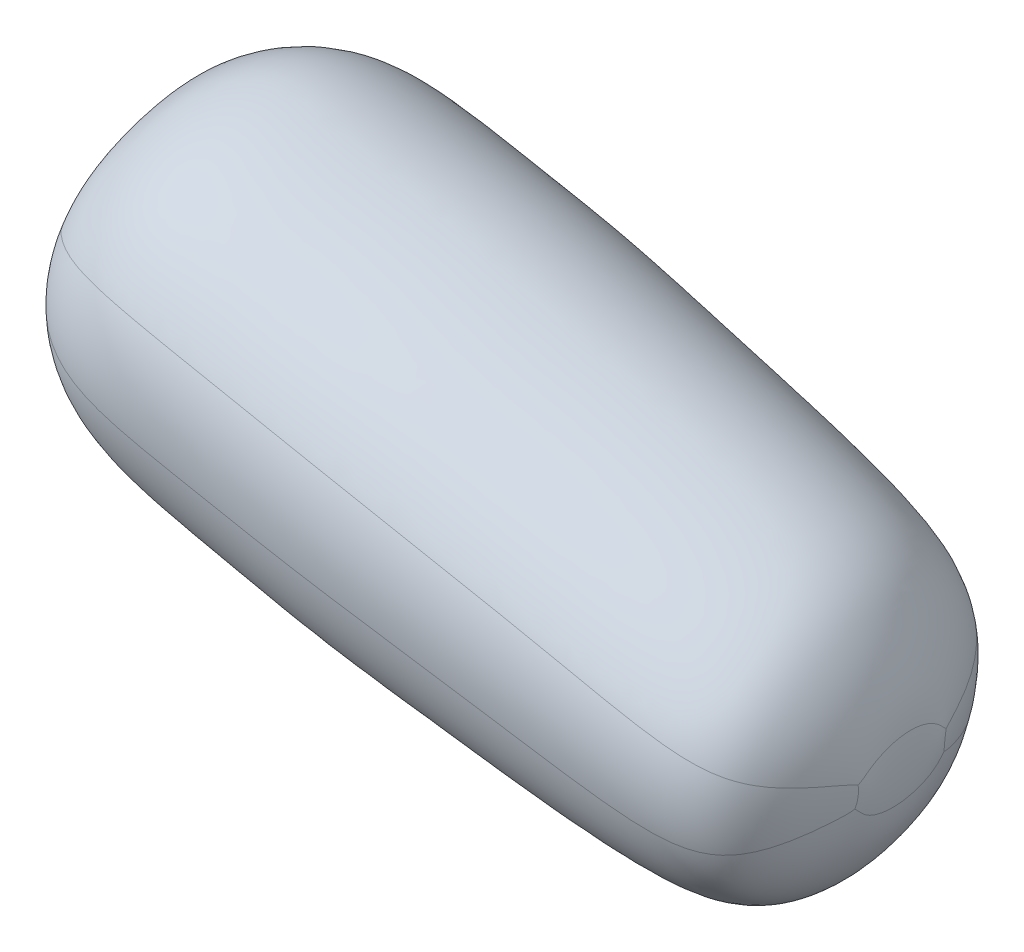
ISO-10303-21;
HEADER;
FILE_DESCRIPTION(('STEP AP214'),'2;1');
FILE_NAME('part.step','',(''),(''),'','','');
FILE_SCHEMA(('AUTOMOTIVE_DESIGN { 1 0 10303 214 1 1 1 1 }'));
ENDSEC;
DATA;
#1=APPLICATION_CONTEXT('core data for automotive mechanical design processes');
#2=APPLICATION_PROTOCOL_DEFINITION('international standard','automotive_design',2000,#1);
#3=PRODUCT_CONTEXT('',#1,'mechanical');
#4=PRODUCT('Part','Part','',(#3));
#5=PRODUCT_RELATED_PRODUCT_CATEGORY('part','',(#4));
#6=PRODUCT_DEFINITION_FORMATION('','',#4);
#7=PRODUCT_DEFINITION_CONTEXT('part definition',#1,'design');
#8=PRODUCT_DEFINITION('design','',#6,#7);
#9=PRODUCT_DEFINITION_SHAPE('','',#8);
#10=(LENGTH_UNIT() NAMED_UNIT(*) SI_UNIT(.MILLI.,.METRE.));
#11=(NAMED_UNIT(*) PLANE_ANGLE_UNIT() SI_UNIT($,.RADIAN.));
#12=(NAMED_UNIT(*) SI_UNIT($,.STERADIAN.) SOLID_ANGLE_UNIT());
#13=UNCERTAINTY_MEASURE_WITH_UNIT(LENGTH_MEASURE(1.E-05),#10,'distance_accuracy_value','');
#14=(GEOMETRIC_REPRESENTATION_CONTEXT(3) GLOBAL_UNCERTAINTY_ASSIGNED_CONTEXT((#13)) GLOBAL_UNIT_ASSIGNED_CONTEXT((#10,
#11,#12)) REPRESENTATION_CONTEXT('',''));
#15=CARTESIAN_POINT('',(0.,0.,0.));
#16=DIRECTION('',(0.,0.,1.));
#17=DIRECTION('',(1.,0.,0.));
#18=AXIS2_PLACEMENT_3D('',#15,#16,#17);
#19=CARTESIAN_POINT('',(749.018541667474,1299.29943309952,-39.3241918801321));
#20=CARTESIAN_POINT('',(748.968023117321,1299.12745624252,-39.1103358303124));
#21=CARTESIAN_POINT('',(748.921842982339,1298.60047448023,-38.3958155175608));
#22=CARTESIAN_POINT('',(748.958254212354,1298.18930311902,-36.544455689012));
#23=CARTESIAN_POINT('',(749.067359383194,1298.22396791715,-34.3213677022218));
#24=CARTESIAN_POINT('',(749.170808756302,1298.80538507709,-32.4721043275103));
#25=CARTESIAN_POINT('',(749.317559113874,1299.4224221733,-31.7430094882292));
#26=CARTESIAN_POINT('',(749.403543107487,1299.62461093897,-31.5344131035057));
#27=CARTESIAN_POINT('',(749.084853868602,1299.15538746618,-39.5640009505484));
#28=CARTESIAN_POINT('',(749.050128969421,1298.66738811878,-39.376097921347));
#29=CARTESIAN_POINT('',(748.985205907322,1297.81789531565,-38.6021233571736));
#30=CARTESIAN_POINT('',(749.00364811543,1297.12814905394,-36.5923854652337));
#31=CARTESIAN_POINT('',(749.103959058563,1297.14198785673,-34.1607295717356));
#32=CARTESIAN_POINT('',(749.210329856262,1298.01205297038,-32.1958273075664));
#33=CARTESIAN_POINT('',(749.393326789782,1298.96928019339,-31.4266106565444));
#34=CARTESIAN_POINT('',(749.484418942238,1299.49913433185,-31.2719154953125));
#35=CARTESIAN_POINT('',(749.508329764697,1298.74755809971,-40.6771228116173));
#36=CARTESIAN_POINT('',(749.457194964389,1297.94447521268,-40.4427472239462));
#37=CARTESIAN_POINT('',(749.367917852987,1296.45819919977,-39.4599283473798));
#38=CARTESIAN_POINT('',(749.36514847526,1295.21237476676,-36.8801333719154));
#39=CARTESIAN_POINT('',(749.482979811134,1295.1903337214,-33.7123004317897));
#40=CARTESIAN_POINT('',(749.597838271913,1296.68020352945,-31.2406782504654));
#41=CARTESIAN_POINT('',(749.856138915369,1298.32535172501,-30.2804538632428));
#42=CARTESIAN_POINT('',(749.994292770972,1299.19217093011,-30.1011356266091));
#43=CARTESIAN_POINT('',(751.159101495368,1298.16254087205,-42.5301420695348));
#44=CARTESIAN_POINT('',(751.090739807056,1297.03129175183,-42.2197436658514));
#45=CARTESIAN_POINT('',(750.978604694835,1294.87139937441,-40.9206519017501));
#46=CARTESIAN_POINT('',(750.988425906881,1293.06120799126,-37.4366596610061));
#47=CARTESIAN_POINT('',(751.134735672272,1293.02703465824,-33.1429411317832));
#48=CARTESIAN_POINT('',(751.290427862375,1295.13956930941,-29.7995788399963));
#49=CARTESIAN_POINT('',(751.627693644699,1297.50121875444,-28.5578467240097));
#50=CARTESIAN_POINT('',(751.81180027039,1298.71775647201,-28.3327488822175));
#51=CARTESIAN_POINT('',(754.158925568147,1297.75217231123,-44.0966049191266));
#52=CARTESIAN_POINT('',(754.077962942074,1296.39950812657,-43.7583980302759));
#53=CARTESIAN_POINT('',(753.9284249418,1293.79667230982,-42.2545805197566));
#54=CARTESIAN_POINT('',(753.939011988292,1291.66450571481,-38.1003517039714));
#55=CARTESIAN_POINT('',(754.136532396949,1291.5170637204,-32.7433163500145));
#56=CARTESIAN_POINT('',(754.185210396786,1294.0676386807,-28.8669009994952));
#57=CARTESIAN_POINT('',(754.624516853756,1296.90224055679,-27.3499805738409));
#58=CARTESIAN_POINT('',(754.874182900671,1298.36097473205,-27.0935829459881));
#59=CARTESIAN_POINT('',(759.260059202705,1296.72634151576,-44.0892882591809));
#60=CARTESIAN_POINT('',(759.188571861757,1295.38447899291,-43.7634695952496));
#61=CARTESIAN_POINT('',(759.116865196907,1292.81337476417,-42.3664437740535));
#62=CARTESIAN_POINT('',(759.051094584353,1290.60771608189,-38.1767353516374));
#63=CARTESIAN_POINT('',(759.269649343386,1290.50676225331,-32.8325519254892));
#64=CARTESIAN_POINT('',(759.272897360054,1293.11550727952,-28.6961828423486));
#65=CARTESIAN_POINT('',(759.592042212166,1295.92873935312,-27.3697014354678));
#66=CARTESIAN_POINT('',(759.777743721762,1297.36899138893,-27.1634403821383));
#67=CARTESIAN_POINT('',(764.359598507454,1295.68966984192,-44.1377718399809));
#68=CARTESIAN_POINT('',(764.297141783323,1294.3497237597,-43.8222420731529));
#69=CARTESIAN_POINT('',(764.303322185729,1291.79340975998,-42.5234024059993));
#70=CARTESIAN_POINT('',(764.160442736961,1289.49909222758,-38.2700821984146));
#71=CARTESIAN_POINT('',(764.401450616776,1289.44423329104,-32.9031520404126));
#72=CARTESIAN_POINT('',(764.359114121423,1292.12893484192,-28.4775271784854));
#73=CARTESIAN_POINT('',(764.559390726144,1294.93942759454,-27.3339008787694));
#74=CARTESIAN_POINT('',(764.681927217236,1296.37068424349,-27.176733804727));
#75=CARTESIAN_POINT('',(769.305658000978,1294.47848171011,-43.9758059663483));
#76=CARTESIAN_POINT('',(769.246563482863,1293.17482879811,-43.6646991355105));
#77=CARTESIAN_POINT('',(769.21216591875,1290.70191218997,-42.4016559067257));
#78=CARTESIAN_POINT('',(769.304206445576,1288.39484916011,-38.2747122486566));
#79=CARTESIAN_POINT('',(769.63861961332,1288.42080287424,-33.0709216037393));
#80=CARTESIAN_POINT('',(769.791706729893,1291.08679895335,-28.8649703374483));
#81=CARTESIAN_POINT('',(769.980749126011,1293.71904473488,-27.7921705999364));
#82=CARTESIAN_POINT('',(770.097852166481,1295.06798170679,-27.6410399972934));
#83=CARTESIAN_POINT('',(774.250124603961,1293.25644652775,-43.8696367085395));
#84=CARTESIAN_POINT('',(774.1939982776,1291.98021155004,-43.5608669169528));
#85=CARTESIAN_POINT('',(774.11917496312,1289.57379726366,-42.3250508260744));
#86=CARTESIAN_POINT('',(774.445080130759,1287.2387616545,-38.29627223435));
#87=CARTESIAN_POINT('',(774.874549501232,1287.34516095879,-33.2200726487472));
#88=CARTESIAN_POINT('',(775.22275257202,1290.0102060318,-29.2044590474841));
#89=CARTESIAN_POINT('',(775.401856684461,1292.48282243605,-28.1948964196627));
#90=CARTESIAN_POINT('',(775.51435123683,1293.75893167989,-28.0487657678662));
#91=CARTESIAN_POINT('',(779.911604390351,1291.88631842835,-43.5345811251691));
#92=CARTESIAN_POINT('',(779.84212559963,1290.74442982744,-43.2060765564798));
#93=CARTESIAN_POINT('',(779.792366170491,1288.6415149776,-41.9550327097827));
#94=CARTESIAN_POINT('',(779.969778214876,1286.89541935905,-38.1059991457864));
#95=CARTESIAN_POINT('',(780.553411945737,1287.10996654145,-33.7431364954069));
#96=CARTESIAN_POINT('',(780.980248317365,1289.03288607653,-29.8618781750851));
#97=CARTESIAN_POINT('',(781.034947373286,1291.10250828784,-28.8442018591539));
#98=CARTESIAN_POINT('',(781.088743792467,1292.24585692288,-28.6598410091077));
#99=CARTESIAN_POINT('',(781.954466116197,1291.85891593961,-41.9992549173569));
#100=CARTESIAN_POINT('',(781.900042601189,1290.96443613594,-41.7419267914149));
#101=CARTESIAN_POINT('',(781.861037021472,1289.31716383133,-40.7619414842372));
#102=CARTESIAN_POINT('',(782.000030012187,1287.94938613228,-37.7468677684114));
#103=CARTESIAN_POINT('',(782.457129097251,1288.11744231065,-34.3292764202205));
#104=CARTESIAN_POINT('',(782.791487287273,1289.62371590093,-31.2889499508345));
#105=CARTESIAN_POINT('',(782.834387591956,1291.24493251512,-30.4917854595828));
#106=CARTESIAN_POINT('',(782.876535467167,1292.14055692621,-30.3473716754841));
#107=CARTESIAN_POINT('',(783.221064790446,1292.39637914558,-40.1130063796312));
#108=CARTESIAN_POINT('',(783.185705860261,1291.81496718503,-39.945746443659));
#109=CARTESIAN_POINT('',(783.160407096932,1290.74423970264,-39.3087677360611));
#110=CARTESIAN_POINT('',(783.250696132911,1289.85516615688,-37.3489553897654));
#111=CARTESIAN_POINT('',(783.547751089496,1289.96438650962,-35.1275007675587));
#112=CARTESIAN_POINT('',(783.765164160147,1290.94350235985,-33.1513155412431));
#113=CARTESIAN_POINT('',(783.793027532704,1291.99727819779,-32.6331532495534));
#114=CARTESIAN_POINT('',(783.820424786622,1292.57943094054,-32.5392837346044));
#115=CARTESIAN_POINT('',(783.733848706613,1292.70458484944,-38.9132354218247));
#116=CARTESIAN_POINT('',(783.710272124661,1292.31697504891,-38.8017269676203));
#117=CARTESIAN_POINT('',(783.693423193036,1291.60316010099,-38.3770788305007));
#118=CARTESIAN_POINT('',(783.753587950324,1291.01045223097,-37.0705363052411));
#119=CARTESIAN_POINT('',(783.951678859933,1291.08325604569,-35.5895729586269));
#120=CARTESIAN_POINT('',(784.096566479582,1291.73600942798,-34.272110594069));
#121=CARTESIAN_POINT('',(784.115125254385,1292.43852346069,-33.9266641619919));
#122=CARTESIAN_POINT('',(784.133386128494,1292.82662346234,-33.864082655158));
#123=CARTESIAN_POINT('',(783.824675659282,1292.82193916687,-38.6903076526872));
#124=CARTESIAN_POINT('',(783.858300844621,1292.68681142531,-38.5230895410272));
#125=CARTESIAN_POINT('',(783.84827987084,1292.23715533116,-38.158234930649));
#126=CARTESIAN_POINT('',(783.906766304208,1291.8757474699,-37.0329882576437));
#127=CARTESIAN_POINT('',(784.072469242042,1291.93054155875,-35.7468532540145));
#128=CARTESIAN_POINT('',(784.192443790283,1292.34199258987,-34.5957975937848));
#129=CARTESIAN_POINT('',(784.206802638554,1292.79102214041,-34.2764277174584));
#130=CARTESIAN_POINT('',(784.18841742658,1292.93225591494,-34.1181188610803));
#131=(BOUNDED_SURFACE() B_SPLINE_SURFACE(3,3,((#19,#20,#21,#22,#23,#24,#25,#26),(#27,#28,#29,
#30,#31,#32,#33,#34),(#35,#36,#37,#38,#39,#40,#41,#42),(#43,#44,#45,#46,#47,#48,#49,#50),(#51,
#52,#53,#54,#55,#56,#57,#58),(#59,#60,#61,#62,#63,#64,#65,#66),(#67,#68,#69,#70,#71,#72,#73,
#74),(#75,#76,#77,#78,#79,#80,#81,#82),(#83,#84,#85,#86,#87,#88,#89,#90),(#91,#92,#93,#94,#95,
#96,#97,#98),(#99,#100,#101,#102,#103,#104,#105,#106),(#107,#108,#109,#110,#111,#112,#113,#114),
(#115,#116,#117,#118,#119,#120,#121,#122),(#123,#124,#125,#126,#127,#128,#129,#130)),
.UNSPECIFIED.,.F.,.F.,.F.) B_SPLINE_SURFACE_WITH_KNOTS((4,1,1,1,1,1,1,1,1,1,1,4),(4,1,1,1,1,4),
(0.,1.,2.,3.,4.,5.,6.,7.,8.,9.,10.,11.),(0.,1.,2.,3.,4.,5.),
.UNSPECIFIED.) GEOMETRIC_REPRESENTATION_ITEM() RATIONAL_B_SPLINE_SURFACE(((0.75,1.,1.,1.,1.,1.,
1.,0.75),(1.,1.,1.,1.,1.,1.,1.,1.),(1.,1.,1.,1.,1.,1.,1.,1.),(1.,1.,1.,1.,1.,1.,1.,1.),(1.,1.,
1.,1.,1.,1.,1.,1.),(1.,1.,1.,1.,1.,1.,1.,1.),(1.,1.,1.,1.,1.,1.,1.,1.),(1.,1.,1.,1.,1.,1.,1.,
1.),(1.,1.,1.,1.,1.,1.,1.,1.),(1.,1.,1.,1.,1.,1.,1.,1.),(1.,1.,1.,1.,1.,1.,1.,1.),(1.,1.,1.,1.,
1.,1.,1.,1.),(1.,1.,1.,1.,1.,1.,1.,1.),(0.75,1.,1.,1.,1.,1.,1.,0.75))) REPRESENTATION_ITEM('') SURFACE());
#132=CARTESIAN_POINT('',(783.824675659282,1292.82193916687,-38.6903076526872));
#133=CARTESIAN_POINT('',(783.733848706613,1292.70458484944,-38.9132354218247));
#134=CARTESIAN_POINT('',(783.221064790446,1292.39637914558,-40.1130063796312));
#135=CARTESIAN_POINT('',(781.954466116197,1291.85891593961,-41.9992549173569));
#136=CARTESIAN_POINT('',(779.911604390351,1291.88631842835,-43.5345811251691));
#137=CARTESIAN_POINT('',(774.250124603961,1293.25644652775,-43.8696367085395));
#138=CARTESIAN_POINT('',(769.305658000978,1294.47848171011,-43.9758059663483));
#139=CARTESIAN_POINT('',(764.359598507454,1295.68966984192,-44.1377718399809));
#140=CARTESIAN_POINT('',(759.260059202705,1296.72634151576,-44.0892882591809));
#141=CARTESIAN_POINT('',(754.158925568147,1297.75217231123,-44.0966049191266));
#142=CARTESIAN_POINT('',(751.159101495368,1298.16254087205,-42.5301420695348));
#143=CARTESIAN_POINT('',(749.508329764697,1298.74755809971,-40.6771228116173));
#144=CARTESIAN_POINT('',(749.084853868602,1299.15538746618,-39.5640009505484));
#145=CARTESIAN_POINT('',(749.018541667474,1299.29943309952,-39.3241918801321));
#146=(BOUNDED_CURVE() B_SPLINE_CURVE(3,(#132,#133,#134,#135,#136,#137,#138,#139,#140,#141,#142,
#143,#144,#145),.UNSPECIFIED.,.F.,.F.) B_SPLINE_CURVE_WITH_KNOTS((4,1,1,1,1,1,1,1,1,1,1,4),(0.,
1.,2.,3.,4.,5.,6.,7.,8.,9.,10.,11.),
.UNSPECIFIED.) CURVE() GEOMETRIC_REPRESENTATION_ITEM() RATIONAL_B_SPLINE_CURVE((0.75,1.,1.,1.,
1.,1.,1.,1.,1.,1.,1.,1.,1.,0.75)) REPRESENTATION_ITEM(''));
#147=CARTESIAN_POINT('',(783.824675659282,1292.82193916687,-38.6903076526872));
#148=VERTEX_POINT('',#147);
#149=CARTESIAN_POINT('',(749.018541667474,1299.29943309952,-39.3241918801321));
#150=VERTEX_POINT('',#149);
#151=EDGE_CURVE('E73',#148,#150,#146,.T.);
#152=CARTESIAN_POINT('',(783.824675659282,1292.82193916687,-38.6903076526872));
#153=CARTESIAN_POINT('',(783.858300844621,1292.68681142531,-38.5230895410272));
#154=CARTESIAN_POINT('',(783.84827987084,1292.23715533116,-38.158234930649));
#155=CARTESIAN_POINT('',(783.906766304208,1291.8757474699,-37.0329882576437));
#156=CARTESIAN_POINT('',(784.072469242042,1291.93054155875,-35.7468532540145));
#157=CARTESIAN_POINT('',(784.192443790283,1292.34199258987,-34.5957975937848));
#158=CARTESIAN_POINT('',(784.206802638554,1292.79102214041,-34.2764277174584));
#159=CARTESIAN_POINT('',(784.18841742658,1292.93225591494,-34.1181188610803));
#160=(BOUNDED_CURVE() B_SPLINE_CURVE(3,(#152,#153,#154,#155,#156,#157,#158,#159),.UNSPECIFIED.,
.F.,.F.) B_SPLINE_CURVE_WITH_KNOTS((4,1,1,1,1,4),(0.,1.,2.,3.,4.,5.),
.UNSPECIFIED.) CURVE() GEOMETRIC_REPRESENTATION_ITEM() RATIONAL_B_SPLINE_CURVE((0.75,1.,1.,1.,
1.,1.,1.,0.75)) REPRESENTATION_ITEM(''));
#161=CARTESIAN_POINT('',(784.18841742658,1292.93225591494,-34.1181188610803));
#162=VERTEX_POINT('',#161);
#163=EDGE_CURVE('E77',#162,#148,#160,.F.);
#164=CARTESIAN_POINT('',(749.403543107487,1299.62461093897,-31.5344131035057));
#165=CARTESIAN_POINT('',(749.484418942238,1299.49913433185,-31.2719154953125));
#166=CARTESIAN_POINT('',(749.994292770972,1299.19217093011,-30.1011356266091));
#167=CARTESIAN_POINT('',(751.81180027039,1298.71775647201,-28.3327488822175));
#168=CARTESIAN_POINT('',(754.874182900671,1298.36097473205,-27.0935829459881));
#169=CARTESIAN_POINT('',(759.777743721762,1297.36899138893,-27.1634403821383));
#170=CARTESIAN_POINT('',(764.681927217236,1296.37068424349,-27.176733804727));
#171=CARTESIAN_POINT('',(770.097852166481,1295.06798170679,-27.6410399972934));
#172=CARTESIAN_POINT('',(775.51435123683,1293.75893167989,-28.0487657678662));
#173=CARTESIAN_POINT('',(781.088743792467,1292.24585692288,-28.6598410091077));
#174=CARTESIAN_POINT('',(782.876535467167,1292.14055692621,-30.3473716754841));
#175=CARTESIAN_POINT('',(783.820424786622,1292.57943094054,-32.5392837346044));
#176=CARTESIAN_POINT('',(784.133386128494,1292.82662346234,-33.864082655158));
#177=CARTESIAN_POINT('',(784.18841742658,1292.93225591494,-34.1181188610803));
#178=(BOUNDED_CURVE() B_SPLINE_CURVE(3,(#164,#165,#166,#167,#168,#169,#170,#171,#172,#173,#174,
#175,#176,#177),.UNSPECIFIED.,.F.,.F.) B_SPLINE_CURVE_WITH_KNOTS((4,1,1,1,1,1,1,1,1,1,1,4),(0.,
1.,2.,3.,4.,5.,6.,7.,8.,9.,10.,11.),
.UNSPECIFIED.) CURVE() GEOMETRIC_REPRESENTATION_ITEM() RATIONAL_B_SPLINE_CURVE((0.75,1.,1.,1.,
1.,1.,1.,1.,1.,1.,1.,1.,1.,0.75)) REPRESENTATION_ITEM(''));
#179=CARTESIAN_POINT('',(749.403543107487,1299.62461093896,-31.5344131035057));
#180=VERTEX_POINT('',#179);
#181=EDGE_CURVE('E105',#180,#162,#178,.T.);
#182=CARTESIAN_POINT('',(749.018541667474,1299.29943309952,-39.3241918801321));
#183=CARTESIAN_POINT('',(748.968023117321,1299.12745624252,-39.1103358303124));
#184=CARTESIAN_POINT('',(748.921842982339,1298.60047448023,-38.3958155175608));
#185=CARTESIAN_POINT('',(748.958254212354,1298.18930311902,-36.544455689012));
#186=CARTESIAN_POINT('',(749.067359383194,1298.22396791715,-34.3213677022218));
#187=CARTESIAN_POINT('',(749.170808756302,1298.80538507709,-32.4721043275103));
#188=CARTESIAN_POINT('',(749.317559113874,1299.4224221733,-31.7430094882292));
#189=CARTESIAN_POINT('',(749.403543107487,1299.62461093897,-31.5344131035057));
#190=(BOUNDED_CURVE() B_SPLINE_CURVE(3,(#182,#183,#184,#185,#186,#187,#188,#189),.UNSPECIFIED.,
.F.,.F.) B_SPLINE_CURVE_WITH_KNOTS((4,1,1,1,1,4),(0.,1.,2.,3.,4.,5.),
.UNSPECIFIED.) CURVE() GEOMETRIC_REPRESENTATION_ITEM() RATIONAL_B_SPLINE_CURVE((0.75,1.,1.,1.,
1.,1.,1.,0.75)) REPRESENTATION_ITEM(''));
#191=EDGE_CURVE('E79',#150,#180,#190,.T.);
#192=ORIENTED_EDGE('',*,*,#151,.F.);
#193=ORIENTED_EDGE('',*,*,#163,.F.);
#194=ORIENTED_EDGE('',*,*,#181,.F.);
#195=ORIENTED_EDGE('',*,*,#191,.F.);
#196=EDGE_LOOP('',(#192,#193,#194,#195));
#197=FACE_BOUND('',#196,.T.);
#198=ADVANCED_FACE('F33',(#197),#131,.T.);
#199=CARTESIAN_POINT('',(749.101250467563,1300.48399524673,-39.3216260351981));
#200=CARTESIAN_POINT('',(749.073592183802,1300.62867331672,-39.112077674764));
#201=CARTESIAN_POINT('',(749.100918501394,1301.05500426717,-38.4400274260165));
#202=CARTESIAN_POINT('',(749.212644565611,1301.48806183071,-36.6751346326217));
#203=CARTESIAN_POINT('',(749.398216643835,1301.59298521083,-34.5896839463824));
#204=CARTESIAN_POINT('',(749.489589829749,1301.36064860402,-32.6766597096824));
#205=CARTESIAN_POINT('',(749.535321997387,1300.99397462831,-31.9037756667972));
#206=CARTESIAN_POINT('',(749.578946975891,1300.86601079745,-31.6666632235885));
#207=CARTESIAN_POINT('',(749.040902796788,1300.17042163372,-39.2935484823008));
#208=CARTESIAN_POINT('',(748.925238558502,1300.14620416065,-38.8463742085353));
#209=CARTESIAN_POINT('',(748.923110180213,1300.268363916,-38.2057944938202));
#210=CARTESIAN_POINT('',(749.002822683051,1300.41487817064,-36.5445403136712));
#211=CARTESIAN_POINT('',(749.147070733387,1300.49408103076,-34.5790675237182));
#212=CARTESIAN_POINT('',(749.245999664246,1300.51945667678,-32.8233608587861));
#213=CARTESIAN_POINT('',(749.321662148964,1300.45988387879,-32.119127586622));
#214=CARTESIAN_POINT('',(749.493929540927,1300.53498350725,-31.6557829618748));
#215=CARTESIAN_POINT('',(749.002748016501,1299.61545558991,-39.2982388595247));
#216=CARTESIAN_POINT('',(748.885917265211,1299.58752436625,-38.8445737392996));
#217=CARTESIAN_POINT('',(748.858480057356,1299.38305364479,-38.189507677948));
#218=CARTESIAN_POINT('',(748.912860309285,1299.25045718408,-36.4965259127793));
#219=CARTESIAN_POINT('',(749.030759707826,1299.30594797757,-34.4820058327189));
#220=CARTESIAN_POINT('',(749.131287656343,1299.59871718382,-32.7483813474542));
#221=CARTESIAN_POINT('',(749.241791437975,1299.87556415318,-32.059408319914));
#222=CARTESIAN_POINT('',(749.40865126634,1299.95227631174,-31.5883143269973));
#223=CARTESIAN_POINT('',(749.018541667474,1299.29943309952,-39.3241918801321));
#224=CARTESIAN_POINT('',(748.968023117321,1299.12745624252,-39.1103358303124));
#225=CARTESIAN_POINT('',(748.921842982339,1298.60047448023,-38.3958155175608));
#226=CARTESIAN_POINT('',(748.958254212354,1298.18930311902,-36.544455689012));
#227=CARTESIAN_POINT('',(749.067359383194,1298.22396791715,-34.3213677022218));
#228=CARTESIAN_POINT('',(749.170808756302,1298.80538507709,-32.4721043275103));
#229=CARTESIAN_POINT('',(749.317559113874,1299.4224221733,-31.7430094882292));
#230=CARTESIAN_POINT('',(749.403543107487,1299.62461093897,-31.5344131035057));
#231=(BOUNDED_SURFACE() B_SPLINE_SURFACE(3,3,((#199,#200,#201,#202,#203,#204,#205,#206),(#207,
#208,#209,#210,#211,#212,#213,#214),(#215,#216,#217,#218,#219,#220,#221,#222),(#223,#224,#225,
#226,#227,#228,#229,#230)),.UNSPECIFIED.,.F.,.F.,.F.) B_SPLINE_SURFACE_WITH_KNOTS((4,4),(4,1,1,
1,1,4),(0.,1.),(0.,1.,2.,3.,4.,5.),
.UNSPECIFIED.) GEOMETRIC_REPRESENTATION_ITEM() RATIONAL_B_SPLINE_SURFACE(((0.75,1.,1.,1.,1.,1.,
1.,0.75),(1.,1.,1.,1.,1.,1.,1.,1.),(1.,1.,1.,1.,1.,1.,1.,1.),(0.75,1.,1.,1.,1.,1.,1.,0.75))) REPRESENTATION_ITEM('') SURFACE());
#232=CARTESIAN_POINT('',(749.101250467563,1300.48399524673,-39.3216260351981));
#233=CARTESIAN_POINT('',(749.040902796788,1300.17042163372,-39.2935484823008));
#234=CARTESIAN_POINT('',(749.002748016501,1299.61545558991,-39.2982388595247));
#235=CARTESIAN_POINT('',(749.018541667474,1299.29943309952,-39.3241918801321));
#236=(BOUNDED_CURVE() B_SPLINE_CURVE(3,(#232,#233,#234,#235),.UNSPECIFIED.,.F.,
.F.) B_SPLINE_CURVE_WITH_KNOTS((4,4),(0.,1.),
.UNSPECIFIED.) CURVE() GEOMETRIC_REPRESENTATION_ITEM() RATIONAL_B_SPLINE_CURVE((0.75,1.,1.,0.75)) REPRESENTATION_ITEM(''));
#237=CARTESIAN_POINT('',(749.101250467562,1300.48399524673,-39.321626035198));
#238=VERTEX_POINT('',#237);
#239=EDGE_CURVE('E82',#150,#238,#236,.F.);
#240=CARTESIAN_POINT('',(749.403543107487,1299.62461093897,-31.5344131035057));
#241=CARTESIAN_POINT('',(749.40865126634,1299.95227631174,-31.5883143269973));
#242=CARTESIAN_POINT('',(749.493929540927,1300.53498350725,-31.6557829618748));
#243=CARTESIAN_POINT('',(749.578946975891,1300.86601079745,-31.6666632235885));
#244=(BOUNDED_CURVE() B_SPLINE_CURVE(3,(#240,#241,#242,#243),.UNSPECIFIED.,.F.,
.F.) B_SPLINE_CURVE_WITH_KNOTS((4,4),(0.,1.),
.UNSPECIFIED.) CURVE() GEOMETRIC_REPRESENTATION_ITEM() RATIONAL_B_SPLINE_CURVE((0.75,1.,1.,0.75)) REPRESENTATION_ITEM(''));
#245=CARTESIAN_POINT('',(749.578946975891,1300.86601079745,-31.6666632235885));
#246=VERTEX_POINT('',#245);
#247=EDGE_CURVE('E96',#246,#180,#244,.F.);
#248=CARTESIAN_POINT('',(749.578946975891,1300.86601079745,-31.6666632235885));
#249=CARTESIAN_POINT('',(749.535321997387,1300.99397462831,-31.9037756667972));
#250=CARTESIAN_POINT('',(749.489589829749,1301.36064860402,-32.6766597096824));
#251=CARTESIAN_POINT('',(749.398216643835,1301.59298521083,-34.5896839463824));
#252=CARTESIAN_POINT('',(749.212644565611,1301.48806183071,-36.6751346326217));
#253=CARTESIAN_POINT('',(749.100918501394,1301.05500426717,-38.4400274260165));
#254=CARTESIAN_POINT('',(749.073592183802,1300.62867331672,-39.112077674764));
#255=CARTESIAN_POINT('',(749.101250467563,1300.48399524673,-39.3216260351981));
#256=(BOUNDED_CURVE() B_SPLINE_CURVE(3,(#248,#249,#250,#251,#252,#253,#254,#255),.UNSPECIFIED.,
.F.,.F.) B_SPLINE_CURVE_WITH_KNOTS((4,1,1,1,1,4),(0.,1.,2.,3.,4.,5.),
.UNSPECIFIED.) CURVE() GEOMETRIC_REPRESENTATION_ITEM() RATIONAL_B_SPLINE_CURVE((0.75,1.,1.,1.,
1.,1.,1.,0.75)) REPRESENTATION_ITEM(''));
#257=EDGE_CURVE('E54',#238,#246,#256,.F.);
#258=ORIENTED_EDGE('',*,*,#239,.F.);
#259=ORIENTED_EDGE('',*,*,#191,.T.);
#260=ORIENTED_EDGE('',*,*,#247,.F.);
#261=ORIENTED_EDGE('',*,*,#257,.F.);
#262=EDGE_LOOP('',(#258,#259,#260,#261));
#263=FACE_BOUND('',#262,.T.);
#264=ADVANCED_FACE('F190',(#263),#231,.T.);
#265=CARTESIAN_POINT('',(783.89386485346,1293.77582107737,-38.7184259989586));
#266=CARTESIAN_POINT('',(783.820745344025,1293.89107330477,-38.9480454988233));
#267=CARTESIAN_POINT('',(783.351372971606,1294.17609994818,-40.1652079554513));
#268=CARTESIAN_POINT('',(782.154976271259,1294.5969508574,-42.0795718472466));
#269=CARTESIAN_POINT('',(780.167618383781,1295.38167061067,-43.637119036913));
#270=CARTESIAN_POINT('',(774.497709253935,1297.06248381358,-43.8849708398168));
#271=CARTESIAN_POINT('',(769.570746852778,1298.35804353739,-43.9681212228532));
#272=CARTESIAN_POINT('',(764.644107719398,1299.66914762626,-44.1068784425305));
#273=CARTESIAN_POINT('',(759.532119251981,1300.69860075867,-44.0253802519605));
#274=CARTESIAN_POINT('',(754.42055697491,1301.74360801755,-43.9995133135164));
#275=CARTESIAN_POINT('',(751.398159742376,1301.54147123474,-42.5158657050392));
#276=CARTESIAN_POINT('',(749.676906666852,1301.16866413129,-40.6629171018914));
#277=CARTESIAN_POINT('',(749.189256422097,1300.65289078978,-39.5592519485294));
#278=CARTESIAN_POINT('',(749.101250467563,1300.48399524673,-39.3216260351981));
#279=CARTESIAN_POINT('',(783.918128929512,1293.52791169984,-38.6473118575672));
#280=CARTESIAN_POINT('',(783.796153986685,1293.51050677709,-39.0354367158725));
#281=CARTESIAN_POINT('',(783.314492199311,1293.60525128598,-40.2962968337489));
#282=CARTESIAN_POINT('',(782.098233871348,1293.71871919832,-42.2812466415669));
#283=CARTESIAN_POINT('',(780.095161047911,1294.26052680618,-43.894572907916));
#284=CARTESIAN_POINT('',(774.381091925828,1295.88194431767,-44.1780380378603));
#285=CARTESIAN_POINT('',(769.465742773267,1297.15298214205,-44.2776048444529));
#286=CARTESIAN_POINT('',(764.550058881032,1298.43135108875,-44.4349413068721));
#287=CARTESIAN_POINT('',(759.43866789312,1299.46637696997,-44.3682313403713));
#288=CARTESIAN_POINT('',(754.327044446251,1300.50874695682,-44.3593168303811));
#289=CARTESIAN_POINT('',(751.308119004185,1300.47634204403,-42.8117913985232));
#290=CARTESIAN_POINT('',(749.617095609955,1300.41366875436,-40.8888401363909));
#291=CARTESIAN_POINT('',(749.156567035074,1300.19463910678,-39.7407227560553));
#292=CARTESIAN_POINT('',(749.040902796788,1300.17042163372,-39.2935484823008));
#293=CARTESIAN_POINT('',(783.881877426582,1293.07442122584,-38.6345979952316));
#294=CARTESIAN_POINT('',(783.757425288583,1293.09219464998,-39.0247438760398));
#295=CARTESIAN_POINT('',(783.256423720621,1292.97779110611,-40.2802663156034));
#296=CARTESIAN_POINT('',(782.008889631197,1292.75339574328,-42.256583043299));
#297=CARTESIAN_POINT('',(779.981083181054,1293.02820702927,-43.8630856938695));
#298=CARTESIAN_POINT('',(774.30625093033,1294.53268150545,-44.1784065001262));
#299=CARTESIAN_POINT('',(769.364752519093,1295.78213462212,-44.2869127971752));
#300=CARTESIAN_POINT('',(764.422055231585,1297.02961592415,-44.4533016067872));
#301=CARTESIAN_POINT('',(759.331546543653,1298.06820403862,-44.4151069231013));
#302=CARTESIAN_POINT('',(754.239888194222,1299.10483649588,-44.4348118079556));
#303=CARTESIAN_POINT('',(751.22746318368,1299.29378999228,-42.8405404732072));
#304=CARTESIAN_POINT('',(749.559464565013,1299.55064098675,-40.9114983993102));
#305=CARTESIAN_POINT('',(749.119578767773,1299.64338681356,-39.7519039797499));
#306=CARTESIAN_POINT('',(749.002748016501,1299.61545558991,-39.2982388595247));
#307=CARTESIAN_POINT('',(783.824675659282,1292.82193916687,-38.6903076526872));
#308=CARTESIAN_POINT('',(783.733848706613,1292.70458484944,-38.9132354218247));
#309=CARTESIAN_POINT('',(783.221064790446,1292.39637914558,-40.1130063796312));
#310=CARTESIAN_POINT('',(781.954466116197,1291.85891593961,-41.9992549173569));
#311=CARTESIAN_POINT('',(779.911604390351,1291.88631842835,-43.5345811251691));
#312=CARTESIAN_POINT('',(774.250124603961,1293.25644652775,-43.8696367085395));
#313=CARTESIAN_POINT('',(769.305658000978,1294.47848171011,-43.9758059663483));
#314=CARTESIAN_POINT('',(764.359598507454,1295.68966984192,-44.1377718399809));
#315=CARTESIAN_POINT('',(759.260059202705,1296.72634151576,-44.0892882591809));
#316=CARTESIAN_POINT('',(754.158925568147,1297.75217231123,-44.0966049191266));
#317=CARTESIAN_POINT('',(751.159101495368,1298.16254087205,-42.5301420695348));
#318=CARTESIAN_POINT('',(749.508329764697,1298.74755809971,-40.6771228116173));
#319=CARTESIAN_POINT('',(749.084853868602,1299.15538746618,-39.5640009505484));
#320=CARTESIAN_POINT('',(749.018541667474,1299.29943309952,-39.3241918801321));
#321=(BOUNDED_SURFACE() B_SPLINE_SURFACE(3,3,((#265,#266,#267,#268,#269,#270,#271,#272,#273,
#274,#275,#276,#277,#278),(#279,#280,#281,#282,#283,#284,#285,#286,#287,#288,#289,#290,#291,
#292),(#293,#294,#295,#296,#297,#298,#299,#300,#301,#302,#303,#304,#305,#306),(#307,#308,#309,
#310,#311,#312,#313,#314,#315,#316,#317,#318,#319,#320)),.UNSPECIFIED.,.F.,.F.,
.F.) B_SPLINE_SURFACE_WITH_KNOTS((4,4),(4,1,1,1,1,1,1,1,1,1,1,4),(0.,1.),(0.,1.,2.,3.,4.,5.,6.,
7.,8.,9.,10.,11.),
.UNSPECIFIED.) GEOMETRIC_REPRESENTATION_ITEM() RATIONAL_B_SPLINE_SURFACE(((0.75,1.,1.,1.,1.,1.,
1.,1.,1.,1.,1.,1.,1.,0.75),(1.,1.,1.,1.,1.,1.,1.,1.,1.,1.,1.,1.,1.,1.),(1.,1.,1.,1.,1.,1.,1.,1.,
1.,1.,1.,1.,1.,1.),(0.75,1.,1.,1.,1.,1.,1.,1.,1.,1.,1.,1.,1.,0.75))) REPRESENTATION_ITEM('') SURFACE());
#322=CARTESIAN_POINT('',(783.89386485346,1293.77582107737,-38.7184259989586));
#323=CARTESIAN_POINT('',(783.918128929512,1293.52791169984,-38.6473118575672));
#324=CARTESIAN_POINT('',(783.881877426582,1293.07442122584,-38.6345979952316));
#325=CARTESIAN_POINT('',(783.824675659282,1292.82193916687,-38.6903076526872));
#326=(BOUNDED_CURVE() B_SPLINE_CURVE(3,(#322,#323,#324,#325),.UNSPECIFIED.,.F.,
.F.) B_SPLINE_CURVE_WITH_KNOTS((4,4),(0.,1.),
.UNSPECIFIED.) CURVE() GEOMETRIC_REPRESENTATION_ITEM() RATIONAL_B_SPLINE_CURVE((0.75,1.,1.,0.75)) REPRESENTATION_ITEM(''));
#327=CARTESIAN_POINT('',(783.89386485346,1293.77582107737,-38.7184259989586));
#328=VERTEX_POINT('',#327);
#329=EDGE_CURVE('E81',#148,#328,#326,.F.);
#330=CARTESIAN_POINT('',(749.101250467563,1300.48399524673,-39.3216260351981));
#331=CARTESIAN_POINT('',(749.189256422097,1300.65289078978,-39.5592519485294));
#332=CARTESIAN_POINT('',(749.676906666852,1301.16866413129,-40.6629171018914));
#333=CARTESIAN_POINT('',(751.398159742376,1301.54147123474,-42.5158657050392));
#334=CARTESIAN_POINT('',(754.42055697491,1301.74360801755,-43.9995133135164));
#335=CARTESIAN_POINT('',(759.532119251981,1300.69860075867,-44.0253802519605));
#336=CARTESIAN_POINT('',(764.644107719398,1299.66914762626,-44.1068784425305));
#337=CARTESIAN_POINT('',(769.570746852778,1298.35804353739,-43.9681212228532));
#338=CARTESIAN_POINT('',(774.497709253935,1297.06248381358,-43.8849708398168));
#339=CARTESIAN_POINT('',(780.167618383781,1295.38167061067,-43.637119036913));
#340=CARTESIAN_POINT('',(782.154976271259,1294.5969508574,-42.0795718472466));
#341=CARTESIAN_POINT('',(783.351372971606,1294.17609994818,-40.1652079554513));
#342=CARTESIAN_POINT('',(783.820745344025,1293.89107330477,-38.9480454988233));
#343=CARTESIAN_POINT('',(783.89386485346,1293.77582107737,-38.7184259989586));
#344=(BOUNDED_CURVE() B_SPLINE_CURVE(3,(#330,#331,#332,#333,#334,#335,#336,#337,#338,#339,#340,
#341,#342,#343),.UNSPECIFIED.,.F.,.F.) B_SPLINE_CURVE_WITH_KNOTS((4,1,1,1,1,1,1,1,1,1,1,4),(0.,
1.,2.,3.,4.,5.,6.,7.,8.,9.,10.,11.),
.UNSPECIFIED.) CURVE() GEOMETRIC_REPRESENTATION_ITEM() RATIONAL_B_SPLINE_CURVE((0.75,1.,1.,1.,
1.,1.,1.,1.,1.,1.,1.,1.,1.,0.75)) REPRESENTATION_ITEM(''));
#345=EDGE_CURVE('E87',#328,#238,#344,.F.);
#346=ORIENTED_EDGE('',*,*,#329,.F.);
#347=ORIENTED_EDGE('',*,*,#151,.T.);
#348=ORIENTED_EDGE('',*,*,#239,.T.);
#349=ORIENTED_EDGE('',*,*,#345,.F.);
#350=EDGE_LOOP('',(#346,#347,#348,#349));
#351=FACE_BOUND('',#350,.T.);
#352=ADVANCED_FACE('F85',(#351),#321,.T.);
#353=CARTESIAN_POINT('',(783.89386485346,1293.77582107737,-38.7184259989586));
#354=CARTESIAN_POINT('',(783.918128929512,1293.52791169984,-38.6473118575672));
#355=CARTESIAN_POINT('',(783.881877426582,1293.07442122584,-38.6345979952316));
#356=CARTESIAN_POINT('',(783.824675659282,1292.82193916687,-38.6903076526872));
#357=CARTESIAN_POINT('',(783.942720286835,1293.90847822752,-38.5599206404963));
#358=CARTESIAN_POINT('',(784.04010387234,1293.5453166226,-38.2591869992511));
#359=CARTESIAN_POINT('',(784.006329564591,1293.05664780172,-38.2444521144342));
#360=CARTESIAN_POINT('',(783.858300844621,1292.68681142531,-38.5230895410272));
#361=CARTESIAN_POINT('',(783.956293295325,1294.33348125568,-38.2286257088662));
#362=CARTESIAN_POINT('',(784.046341856229,1293.70968082247,-37.967547683885));
#363=CARTESIAN_POINT('',(784.003136548661,1292.87115056132,-37.9393910307973));
#364=CARTESIAN_POINT('',(783.84827987084,1292.23715533116,-38.158234930649));
#365=CARTESIAN_POINT('',(784.044041609662,1294.75812614513,-37.1932747491339));
#366=CARTESIAN_POINT('',(784.114855457188,1293.89399014961,-37.0595536570699));
#367=CARTESIAN_POINT('',(784.059944658109,1292.74104270882,-36.9954402100353));
#368=CARTESIAN_POINT('',(783.906766304208,1291.8757474699,-37.0329882576437));
#369=CARTESIAN_POINT('',(784.171538419941,1294.76837705539,-35.9556685473776));
#370=CARTESIAN_POINT('',(784.232876503159,1293.91296332989,-35.9876580446432));
#371=CARTESIAN_POINT('',(784.193259624158,1292.77782707181,-35.9041335494021));
#372=CARTESIAN_POINT('',(784.072469242042,1291.93054155875,-35.7468532540145));
#373=CARTESIAN_POINT('',(784.257575596712,1294.38128436579,-34.8132425047236));
#374=CARTESIAN_POINT('',(784.314374562689,1293.76368854149,-35.0064610665137));
#375=CARTESIAN_POINT('',(784.288321100985,1292.94797575177,-34.9194845935006));
#376=CARTESIAN_POINT('',(784.192443790283,1292.34199258987,-34.5957975937848));
#377=CARTESIAN_POINT('',(784.262566311652,1294.00196428505,-34.4083593053121));
#378=CARTESIAN_POINT('',(784.320785930257,1293.62789554817,-34.6789629276168));
#379=CARTESIAN_POINT('',(784.298480022743,1293.14352082015,-34.6261912729139));
#380=CARTESIAN_POINT('',(784.206802638554,1292.79102214041,-34.2764277174584));
#381=CARTESIAN_POINT('',(784.234673995564,1293.88119834035,-34.2219266537586));
#382=CARTESIAN_POINT('',(784.249837646821,1293.63378099955,-34.2640121391397));
#383=CARTESIAN_POINT('',(784.225063512664,1293.17912214206,-34.2138462106136));
#384=CARTESIAN_POINT('',(784.18841742658,1292.93225591494,-34.1181188610803));
#385=(BOUNDED_SURFACE() B_SPLINE_SURFACE(3,3,((#353,#354,#355,#356),(#357,#358,#359,#360),(#361,
#362,#363,#364),(#365,#366,#367,#368),(#369,#370,#371,#372),(#373,#374,#375,#376),(#377,#378,
#379,#380),(#381,#382,#383,#384)),.UNSPECIFIED.,.F.,.F.,.F.) B_SPLINE_SURFACE_WITH_KNOTS((4,1,1,
1,1,4),(4,4),(0.,1.,2.,3.,4.,5.),(0.,1.),
.UNSPECIFIED.) GEOMETRIC_REPRESENTATION_ITEM() RATIONAL_B_SPLINE_SURFACE(((0.75,1.,1.,0.75),(1.,
1.,1.,1.),(1.,1.,1.,1.),(1.,1.,1.,1.),(1.,1.,1.,1.),(1.,1.,1.,1.),(1.,1.,1.,1.),(0.75,1.,1.,0.75))) REPRESENTATION_ITEM('') SURFACE());
#386=CARTESIAN_POINT('',(784.234673995564,1293.88119834035,-34.2219266537586));
#387=CARTESIAN_POINT('',(784.262566311652,1294.00196428505,-34.4083593053121));
#388=CARTESIAN_POINT('',(784.257575596712,1294.38128436579,-34.8132425047236));
#389=CARTESIAN_POINT('',(784.171538419941,1294.76837705539,-35.9556685473776));
#390=CARTESIAN_POINT('',(784.044041609662,1294.75812614513,-37.1932747491339));
#391=CARTESIAN_POINT('',(783.956293295316,1294.33348125568,-38.2286257088662));
#392=CARTESIAN_POINT('',(783.942720286835,1293.90847822752,-38.5599206404963));
#393=CARTESIAN_POINT('',(783.89386485346,1293.77582107737,-38.7184259989586));
#394=(BOUNDED_CURVE() B_SPLINE_CURVE(3,(#386,#387,#388,#389,#390,#391,#392,#393),.UNSPECIFIED.,
.F.,.F.) B_SPLINE_CURVE_WITH_KNOTS((4,1,1,1,1,4),(0.,1.,2.,3.,4.,5.),
.UNSPECIFIED.) CURVE() GEOMETRIC_REPRESENTATION_ITEM() RATIONAL_B_SPLINE_CURVE((0.75,1.,1.,1.,
1.,1.,1.,0.75)) REPRESENTATION_ITEM(''));
#395=CARTESIAN_POINT('',(784.234673995563,1293.88119834035,-34.2219266537586));
#396=VERTEX_POINT('',#395);
#397=EDGE_CURVE('E46',#396,#328,#394,.T.);
#398=CARTESIAN_POINT('',(784.18841742658,1292.93225591494,-34.1181188610803));
#399=CARTESIAN_POINT('',(784.225063512664,1293.17912214206,-34.2138462106136));
#400=CARTESIAN_POINT('',(784.249837646821,1293.63378099955,-34.2640121391397));
#401=CARTESIAN_POINT('',(784.234673995564,1293.88119834035,-34.2219266537586));
#402=(BOUNDED_CURVE() B_SPLINE_CURVE(3,(#398,#399,#400,#401),.UNSPECIFIED.,.F.,
.F.) B_SPLINE_CURVE_WITH_KNOTS((4,4),(0.,1.),
.UNSPECIFIED.) CURVE() GEOMETRIC_REPRESENTATION_ITEM() RATIONAL_B_SPLINE_CURVE((0.75,1.,1.,0.75)) REPRESENTATION_ITEM(''));
#403=EDGE_CURVE('E94',#162,#396,#402,.T.);
#404=ORIENTED_EDGE('',*,*,#397,.F.);
#405=ORIENTED_EDGE('',*,*,#403,.F.);
#406=ORIENTED_EDGE('',*,*,#163,.T.);
#407=ORIENTED_EDGE('',*,*,#329,.T.);
#408=EDGE_LOOP('',(#404,#405,#406,#407));
#409=FACE_BOUND('',#408,.T.);
#410=ADVANCED_FACE('F92',(#409),#385,.T.);
#411=CARTESIAN_POINT('',(749.403543107487,1299.62461093897,-31.5344131035057));
#412=CARTESIAN_POINT('',(749.40865126634,1299.95227631174,-31.5883143269973));
#413=CARTESIAN_POINT('',(749.493929540927,1300.53498350725,-31.6557829618748));
#414=CARTESIAN_POINT('',(749.578946975891,1300.86601079745,-31.6666632235885));
#415=CARTESIAN_POINT('',(749.484418942238,1299.49913433185,-31.2719154953125));
#416=CARTESIAN_POINT('',(749.575511094714,1300.02898847031,-31.1172203340805));
#417=CARTESIAN_POINT('',(749.666196932899,1300.61008313572,-31.1924383371385));
#418=CARTESIAN_POINT('',(749.70758938935,1301.06907425678,-31.440431042061));
#419=CARTESIAN_POINT('',(749.994292770972,1299.19217093011,-30.1011356266091));
#420=CARTESIAN_POINT('',(750.132446626557,1300.0589901352,-29.9218173899647));
#421=CARTESIAN_POINT('',(750.279604016035,1300.9700544476,-30.0432931103031));
#422=CARTESIAN_POINT('',(750.361741916764,1301.73292168619,-30.3754353222749));
#423=CARTESIAN_POINT('',(751.81180027039,1298.71775647201,-28.3327488822175));
#424=CARTESIAN_POINT('',(751.99590689609,1299.93429418957,-28.1076510404143));
#425=CARTESIAN_POINT('',(752.195487256302,1301.18654490219,-28.2783214148341));
#426=CARTESIAN_POINT('',(752.318478023875,1302.27007945601,-28.7289323451277));
#427=CARTESIAN_POINT('',(754.874182900671,1298.36097473205,-27.0935829459881));
#428=CARTESIAN_POINT('',(755.123848947586,1299.81970890731,-26.8371853181352));
#429=CARTESIAN_POINT('',(755.403527812932,1301.31987631977,-27.0828502752893));
#430=CARTESIAN_POINT('',(755.557875244787,1302.591294491,-27.6284807522428));
#431=CARTESIAN_POINT('',(759.777743721762,1297.36899138893,-27.1634403821383));
#432=CARTESIAN_POINT('',(759.963445231347,1298.80924342472,-26.957179328798));
#433=CARTESIAN_POINT('',(760.175275824495,1300.28313145952,-27.2078979255413));
#434=CARTESIAN_POINT('',(760.300050317519,1301.52801852402,-27.7507222623219));
#435=CARTESIAN_POINT('',(764.681927217236,1296.37068424349,-27.176733804727));
#436=CARTESIAN_POINT('',(764.804463708319,1297.80194089243,-27.0195667306518));
#437=CARTESIAN_POINT('',(764.949398388119,1299.25920781403,-27.2770457323923));
#438=CARTESIAN_POINT('',(765.045237222956,1300.48569291277,-27.820667628425));
#439=CARTESIAN_POINT('',(770.097852166481,1295.06798170679,-27.6410399972934));
#440=CARTESIAN_POINT('',(770.214955206943,1296.41691867869,-27.4899093946395));
#441=CARTESIAN_POINT('',(770.354640089829,1297.79866973175,-27.7240480581093));
#442=CARTESIAN_POINT('',(770.426939873694,1298.97793951852,-28.2347752495652));
#443=CARTESIAN_POINT('',(775.51435123683,1293.75893167989,-28.0487657678662));
#444=CARTESIAN_POINT('',(775.626845789181,1295.03504092371,-27.9026351160699));
#445=CARTESIAN_POINT('',(775.762282837672,1296.35095120926,-28.115155126377));
#446=CARTESIAN_POINT('',(775.811680851218,1297.49113482505,-28.596591312703));
#447=CARTESIAN_POINT('',(781.088743792467,1292.24585692288,-28.6598410091077));
#448=CARTESIAN_POINT('',(781.142540211648,1293.38920555796,-28.4754801590507));
#449=CARTESIAN_POINT('',(781.222783522056,1294.64109172245,-28.6155966169132));
#450=CARTESIAN_POINT('',(781.260287617767,1295.72576666995,-29.0408474449026));
#451=CARTESIAN_POINT('',(782.876535467167,1292.14055692621,-30.3473716754841));
#452=CARTESIAN_POINT('',(782.918683342397,1293.03618133731,-30.2029578913636));
#453=CARTESIAN_POINT('',(782.981528940506,1294.01682185241,-30.3127125687865));
#454=CARTESIAN_POINT('',(783.010898348898,1294.86648272913,-30.6458238352875));
#455=CARTESIAN_POINT('',(783.820424786622,1292.57943094054,-32.5392837346044));
#456=CARTESIAN_POINT('',(783.847822040539,1293.16158368329,-32.445414219688));
#457=CARTESIAN_POINT('',(783.888684862101,1293.79900124981,-32.5167563356727));
#458=CARTESIAN_POINT('',(783.907770632835,1294.35127988164,-32.7332771100278));
#459=CARTESIAN_POINT('',(784.133386128494,1292.82662346234,-33.864082655158));
#460=CARTESIAN_POINT('',(784.151647002594,1293.21472346398,-33.8015011483133));
#461=CARTESIAN_POINT('',(784.178889363394,1293.63966645093,-33.8490613506734));
#462=CARTESIAN_POINT('',(784.191618028225,1294.00784973643,-33.993408516824));
#463=CARTESIAN_POINT('',(784.18841742658,1292.93225591494,-34.1181188610803));
#464=CARTESIAN_POINT('',(784.225063512664,1293.17912214206,-34.2138462106136));
#465=CARTESIAN_POINT('',(784.249837646821,1293.63378099955,-34.2640121391397));
#466=CARTESIAN_POINT('',(784.234673995564,1293.88119834035,-34.2219266537586));
#467=(BOUNDED_SURFACE() B_SPLINE_SURFACE(3,3,((#411,#412,#413,#414),(#415,#416,#417,#418),(#419,
#420,#421,#422),(#423,#424,#425,#426),(#427,#428,#429,#430),(#431,#432,#433,#434),(#435,#436,
#437,#438),(#439,#440,#441,#442),(#443,#444,#445,#446),(#447,#448,#449,#450),(#451,#452,#453,
#454),(#455,#456,#457,#458),(#459,#460,#461,#462),(#463,#464,#465,#466)),.UNSPECIFIED.,.F.,.F.,
.F.) B_SPLINE_SURFACE_WITH_KNOTS((4,1,1,1,1,1,1,1,1,1,1,4),(4,4),(0.,1.,2.,3.,4.,5.,6.,7.,8.,9.,
10.,11.),(0.,1.),
.UNSPECIFIED.) GEOMETRIC_REPRESENTATION_ITEM() RATIONAL_B_SPLINE_SURFACE(((0.75,1.,1.,0.75),(1.,
1.,1.,1.),(1.,1.,1.,1.),(1.,1.,1.,1.),(1.,1.,1.,1.),(1.,1.,1.,1.),(1.,1.,1.,1.),(1.,1.,1.,1.),
(1.,1.,1.,1.),(1.,1.,1.,1.),(1.,1.,1.,1.),(1.,1.,1.,1.),(1.,1.,1.,1.),(0.75,1.,1.,0.75))) REPRESENTATION_ITEM('') SURFACE());
#468=CARTESIAN_POINT('',(749.578946975891,1300.86601079745,-31.6666632235885));
#469=CARTESIAN_POINT('',(749.70758938935,1301.06907425678,-31.440431042061));
#470=CARTESIAN_POINT('',(750.361741916764,1301.73292168619,-30.3754353222749));
#471=CARTESIAN_POINT('',(752.318478023875,1302.27007945601,-28.7289323451277));
#472=CARTESIAN_POINT('',(755.557875244787,1302.591294491,-27.6284807522428));
#473=CARTESIAN_POINT('',(760.300050317519,1301.52801852402,-27.7507222623219));
#474=CARTESIAN_POINT('',(765.045237222956,1300.48569291277,-27.820667628425));
#475=CARTESIAN_POINT('',(770.426939873694,1298.97793951852,-28.2347752495652));
#476=CARTESIAN_POINT('',(775.811680851218,1297.49113482505,-28.596591312703));
#477=CARTESIAN_POINT('',(781.260287617767,1295.72576666995,-29.0408474449026));
#478=CARTESIAN_POINT('',(783.010898348898,1294.86648272913,-30.6458238352875));
#479=CARTESIAN_POINT('',(783.907770632835,1294.35127988164,-32.7332771100278));
#480=CARTESIAN_POINT('',(784.191618028225,1294.00784973643,-33.993408516824));
#481=CARTESIAN_POINT('',(784.234673995564,1293.88119834035,-34.2219266537586));
#482=(BOUNDED_CURVE() B_SPLINE_CURVE(3,(#468,#469,#470,#471,#472,#473,#474,#475,#476,#477,#478,
#479,#480,#481),.UNSPECIFIED.,.F.,.F.) B_SPLINE_CURVE_WITH_KNOTS((4,1,1,1,1,1,1,1,1,1,1,4),(0.,
1.,2.,3.,4.,5.,6.,7.,8.,9.,10.,11.),
.UNSPECIFIED.) CURVE() GEOMETRIC_REPRESENTATION_ITEM() RATIONAL_B_SPLINE_CURVE((0.75,1.,1.,1.,
1.,1.,1.,1.,1.,1.,1.,1.,1.,0.75)) REPRESENTATION_ITEM(''));
#483=EDGE_CURVE('E11',#246,#396,#482,.T.);
#484=ORIENTED_EDGE('',*,*,#181,.T.);
#485=ORIENTED_EDGE('',*,*,#403,.T.);
#486=ORIENTED_EDGE('',*,*,#483,.F.);
#487=ORIENTED_EDGE('',*,*,#247,.T.);
#488=EDGE_LOOP('',(#484,#485,#486,#487));
#489=FACE_BOUND('',#488,.T.);
#490=ADVANCED_FACE('F161',(#489),#467,.T.);
#491=CARTESIAN_POINT('',(749.578946975891,1300.86601079745,-31.6666632235885));
#492=CARTESIAN_POINT('',(749.535321997387,1300.99397462831,-31.9037756667972));
#493=CARTESIAN_POINT('',(749.489589829749,1301.36064860402,-32.6766597096824));
#494=CARTESIAN_POINT('',(749.398216643835,1301.59298521083,-34.5896839463824));
#495=CARTESIAN_POINT('',(749.212644565611,1301.48806183071,-36.6751346326217));
#496=CARTESIAN_POINT('',(749.100918501394,1301.05500426717,-38.4400274260165));
#497=CARTESIAN_POINT('',(749.073592183802,1300.62867331672,-39.112077674764));
#498=CARTESIAN_POINT('',(749.101250467563,1300.48399524673,-39.3216260351981));
#499=CARTESIAN_POINT('',(749.70758938935,1301.06907425678,-31.440431042061));
#500=CARTESIAN_POINT('',(749.748981845801,1301.52806537784,-31.6884237469834));
#501=CARTESIAN_POINT('',(749.733179995262,1302.20184053127,-32.5299585605788));
#502=CARTESIAN_POINT('',(749.649362554275,1302.69188939091,-34.6003003690466));
#503=CARTESIAN_POINT('',(749.422466448162,1302.56124549078,-36.8057289515615));
#504=CARTESIAN_POINT('',(749.278726822566,1301.84164461835,-38.6742603582129));
#505=CARTESIAN_POINT('',(749.221945809112,1301.11114247278,-39.3777811409926));
#506=CARTESIAN_POINT('',(749.189256422097,1300.65289078978,-39.5592519485294));
#507=CARTESIAN_POINT('',(750.361741916764,1301.73292168619,-30.3754353222749));
#508=CARTESIAN_POINT('',(750.443879817502,1302.49578892478,-30.7075775342467));
#509=CARTESIAN_POINT('',(750.478116641505,1303.72512925432,-31.7931949414459));
#510=CARTESIAN_POINT('',(750.421324144919,1304.71124000483,-34.4486426777266));
#511=CARTESIAN_POINT('',(750.081829230863,1304.52513815791,-37.2320774255475));
#512=CARTESIAN_POINT('',(749.860699861548,1303.21758548066,-39.5786184552651));
#513=CARTESIAN_POINT('',(749.736717723766,1301.92365950821,-40.4369940673919));
#514=CARTESIAN_POINT('',(749.676906666852,1301.16866413129,-40.6629171018914));
#515=CARTESIAN_POINT('',(752.318478023875,1302.27007945601,-28.7289323451277));
#516=CARTESIAN_POINT('',(752.441468791449,1303.35361400983,-29.1795432754104));
#517=CARTESIAN_POINT('',(752.534271141327,1305.18325079991,-30.6406462477235));
#518=CARTESIAN_POINT('',(752.474844016872,1306.61704635098,-34.2280016209587));
#519=CARTESIAN_POINT('',(752.017285016141,1306.37238713173,-37.9731305634069));
#520=CARTESIAN_POINT('',(751.687051792213,1304.50201308473,-41.0937353870422));
#521=CARTESIAN_POINT('',(751.488200480548,1302.60660042542,-42.2199400115662));
#522=CARTESIAN_POINT('',(751.398159742376,1301.54147123474,-42.5158657050392));
#523=CARTESIAN_POINT('',(755.557875244787,1302.591294491,-27.6284807522428));
#524=CARTESIAN_POINT('',(755.712222676661,1303.86271266222,-28.1741112291961));
#525=CARTESIAN_POINT('',(755.770254673462,1305.94805052213,-29.8653032227013));
#526=CARTESIAN_POINT('',(755.708961694617,1307.63775275541,-34.2565646908382));
#527=CARTESIAN_POINT('',(755.045966021498,1307.34360225538,-38.7044761556044));
#528=CARTESIAN_POINT('',(754.713807114115,1305.11009239929,-42.3514856843098));
#529=CARTESIAN_POINT('',(754.514069503559,1302.97846907827,-43.6397097966409));
#530=CARTESIAN_POINT('',(754.42055697491,1301.74360801755,-43.9995133135164));
#531=CARTESIAN_POINT('',(760.300050317519,1301.52801852402,-27.7507222623219));
#532=CARTESIAN_POINT('',(760.424824810543,1302.77290558852,-28.2935465991024));
#533=CARTESIAN_POINT('',(760.500261596386,1304.80467777693,-29.9634067527268));
#534=CARTESIAN_POINT('',(760.578320373495,1306.49538091012,-34.3268565558945));
#535=CARTESIAN_POINT('',(760.10392710722,1306.25451177668,-38.7734912963735));
#536=CARTESIAN_POINT('',(759.785133347343,1304.06337383947,-42.4048759754208));
#537=CARTESIAN_POINT('',(759.625570610841,1301.93082454736,-43.6825291635605));
#538=CARTESIAN_POINT('',(759.532119251981,1300.69860075867,-44.0253802519605));
#539=CARTESIAN_POINT('',(765.045237222956,1300.48569291277,-27.820667628425));
#540=CARTESIAN_POINT('',(765.141076057803,1301.7121780115,-28.3642895244577));
#541=CARTESIAN_POINT('',(765.234562037569,1303.70358456328,-30.0238191051073));
#542=CARTESIAN_POINT('',(765.453460050146,1305.40655315845,-34.3883789729503));
#543=CARTESIAN_POINT('',(765.165738881961,1305.21774657324,-38.8633920677019));
#544=CARTESIAN_POINT('',(764.858344612308,1303.05465998465,-42.5032847206857));
#545=CARTESIAN_POINT('',(764.738156557755,1300.90694416378,-43.778815578189));
#546=CARTESIAN_POINT('',(764.644107719398,1299.66914762626,-44.1068784425305));
#547=CARTESIAN_POINT('',(770.426939873694,1298.97793951852,-28.2347752495652));
#548=CARTESIAN_POINT('',(770.499239657568,1300.15720930532,-28.7455024410429));
#549=CARTESIAN_POINT('',(770.509069027281,1302.11078634638,-30.3201338799707));
#550=CARTESIAN_POINT('',(770.48802277992,1303.89865234648,-34.4963155997787));
#551=CARTESIAN_POINT('',(770.130617862787,1303.77216065969,-38.8660798676621));
#552=CARTESIAN_POINT('',(769.893786741995,1301.64165547423,-42.4393190203209));
#553=CARTESIAN_POINT('',(769.67575093228,1299.56310493272,-43.6586376012535));
#554=CARTESIAN_POINT('',(769.570746852778,1298.35804353739,-43.9681212228532));
#555=CARTESIAN_POINT('',(775.811680851218,1297.49113482505,-28.596591312703));
#556=CARTESIAN_POINT('',(775.861078864783,1298.63131844085,-29.078027499029));
#557=CARTESIAN_POINT('',(775.787796822004,1300.56023233294,-30.5787322236754));
#558=CARTESIAN_POINT('',(775.528287491921,1302.44430140802,-34.5954664571794));
#559=CARTESIAN_POINT('',(775.099427014888,1302.37889505652,-38.8896670561023));
#560=CARTESIAN_POINT('',(774.93111390342,1300.26665566878,-42.420371774099));
#561=CARTESIAN_POINT('',(774.614326582026,1298.24302330952,-43.5919036417626));
#562=CARTESIAN_POINT('',(774.497709253935,1297.06248381358,-43.8849708398168));
#563=CARTESIAN_POINT('',(781.260287617767,1295.72576666995,-29.0408474449026));
#564=CARTESIAN_POINT('',(781.297791713496,1296.81044161745,-29.4660982729028));
#565=CARTESIAN_POINT('',(781.287321475553,1298.6453690785,-30.8868686691462));
#566=CARTESIAN_POINT('',(781.020314190718,1300.48626338224,-34.7273687407861));
#567=CARTESIAN_POINT('',(780.616894538601,1300.48179100115,-38.8615461366545));
#568=CARTESIAN_POINT('',(780.301749329452,1298.52275007924,-42.2868752538479));
#569=CARTESIAN_POINT('',(780.24007571965,1296.50281441514,-43.3796651659317));
#570=CARTESIAN_POINT('',(780.167618383781,1295.38167061067,-43.637119036913));
#571=CARTESIAN_POINT('',(783.010898348898,1294.86648272913,-30.6458238352875));
#572=CARTESIAN_POINT('',(783.040267757299,1295.71614360584,-30.9789351018211));
#573=CARTESIAN_POINT('',(783.032054194659,1297.15350608253,-32.0918708130556));
#574=CARTESIAN_POINT('',(782.822945833082,1298.59554375606,-35.1002690438694));
#575=CARTESIAN_POINT('',(782.506949464576,1298.59203773859,-38.3387125189388));
#576=CARTESIAN_POINT('',(782.259999790513,1297.05746224265,-41.0218706790979));
#577=CARTESIAN_POINT('',(782.211718671179,1295.47518251647,-41.8778970529261));
#578=CARTESIAN_POINT('',(782.154976271259,1294.5969508574,-42.0795718472466));
#579=CARTESIAN_POINT('',(783.907770632835,1294.35127988164,-32.7332771100278));
#580=CARTESIAN_POINT('',(783.926856403589,1294.90355851348,-32.9497978843611));
#581=CARTESIAN_POINT('',(783.921473843427,1295.8378379078,-33.6731967497467));
#582=CARTESIAN_POINT('',(783.785614245815,1296.77517316681,-35.6286720705347));
#583=CARTESIAN_POINT('',(783.580150773891,1296.7729112411,-37.7336533154172));
#584=CARTESIAN_POINT('',(783.419639875692,1295.77542289944,-39.4777025276073));
#585=CARTESIAN_POINT('',(783.388253743902,1294.74694861039,-40.034119077132));
#586=CARTESIAN_POINT('',(783.351372971606,1294.17609994818,-40.1652079554513));
#587=CARTESIAN_POINT('',(784.191618028225,1294.00784973643,-33.993408516824));
#588=CARTESIAN_POINT('',(784.20434669304,1294.37603302195,-34.1377556829965));
#589=CARTESIAN_POINT('',(784.200776630726,1294.99888019009,-34.6200239429444));
#590=CARTESIAN_POINT('',(784.110200336715,1295.62379078092,-35.9236790501012));
#591=CARTESIAN_POINT('',(783.973227762136,1295.62226214064,-37.3269958412197));
#592=CARTESIAN_POINT('',(783.866244734413,1294.95728168889,-38.4897037338365));
#593=CARTESIAN_POINT('',(783.845336701347,1294.27163983244,-38.8606542817633));
#594=CARTESIAN_POINT('',(783.820745344025,1293.89107330477,-38.9480454988233));
#595=CARTESIAN_POINT('',(784.234673995564,1293.88119834035,-34.2219266537586));
#596=CARTESIAN_POINT('',(784.262566311652,1294.00196428505,-34.4083593053121));
#597=CARTESIAN_POINT('',(784.257575596712,1294.38128436579,-34.8132425047236));
#598=CARTESIAN_POINT('',(784.171538419941,1294.76837705539,-35.9556685473776));
#599=CARTESIAN_POINT('',(784.044041609662,1294.75812614513,-37.1932747491339));
#600=CARTESIAN_POINT('',(783.956293295316,1294.33348125568,-38.2286257088662));
#601=CARTESIAN_POINT('',(783.942720286835,1293.90847822752,-38.5599206404963));
#602=CARTESIAN_POINT('',(783.89386485346,1293.77582107737,-38.7184259989586));
#603=(BOUNDED_SURFACE() B_SPLINE_SURFACE(3,3,((#491,#492,#493,#494,#495,#496,#497,#498),(#499,
#500,#501,#502,#503,#504,#505,#506),(#507,#508,#509,#510,#511,#512,#513,#514),(#515,#516,#517,
#518,#519,#520,#521,#522),(#523,#524,#525,#526,#527,#528,#529,#530),(#531,#532,#533,#534,#535,
#536,#537,#538),(#539,#540,#541,#542,#543,#544,#545,#546),(#547,#548,#549,#550,#551,#552,#553,
#554),(#555,#556,#557,#558,#559,#560,#561,#562),(#563,#564,#565,#566,#567,#568,#569,#570),(#571,
#572,#573,#574,#575,#576,#577,#578),(#579,#580,#581,#582,#583,#584,#585,#586),(#587,#588,#589,
#590,#591,#592,#593,#594),(#595,#596,#597,#598,#599,#600,#601,#602)),.UNSPECIFIED.,.F.,.F.,
.F.) B_SPLINE_SURFACE_WITH_KNOTS((4,1,1,1,1,1,1,1,1,1,1,4),(4,1,1,1,1,4),(0.,1.,2.,3.,4.,5.,6.,
7.,8.,9.,10.,11.),(0.,1.,2.,3.,4.,5.),
.UNSPECIFIED.) GEOMETRIC_REPRESENTATION_ITEM() RATIONAL_B_SPLINE_SURFACE(((0.75,1.,1.,1.,1.,1.,
1.,0.75),(1.,1.,1.,1.,1.,1.,1.,1.),(1.,1.,1.,1.,1.,1.,1.,1.),(1.,1.,1.,1.,1.,1.,1.,1.),(1.,1.,
1.,1.,1.,1.,1.,1.),(1.,1.,1.,1.,1.,1.,1.,1.),(1.,1.,1.,1.,1.,1.,1.,1.),(1.,1.,1.,1.,1.,1.,1.,
1.),(1.,1.,1.,1.,1.,1.,1.,1.),(1.,1.,1.,1.,1.,1.,1.,1.),(1.,1.,1.,1.,1.,1.,1.,1.),(1.,1.,1.,1.,
1.,1.,1.,1.),(1.,1.,1.,1.,1.,1.,1.,1.),(0.75,1.,1.,1.,1.,1.,1.,0.75))) REPRESENTATION_ITEM('') SURFACE());
#604=ORIENTED_EDGE('',*,*,#483,.T.);
#605=ORIENTED_EDGE('',*,*,#397,.T.);
#606=ORIENTED_EDGE('',*,*,#345,.T.);
#607=ORIENTED_EDGE('',*,*,#257,.T.);
#608=EDGE_LOOP('',(#604,#605,#606,#607));
#609=FACE_BOUND('',#608,.T.);
#610=ADVANCED_FACE('F35',(#609),#603,.T.);
#611=CLOSED_SHELL('',(#198,#264,#352,#410,#490,#610));
#612=MANIFOLD_SOLID_BREP('B2',#611);
#613=ADVANCED_BREP_SHAPE_REPRESENTATION('',(#18,#612),#14);
#614=SHAPE_DEFINITION_REPRESENTATION(#9,#613);
ENDSEC;
END-ISO-10303-21;
